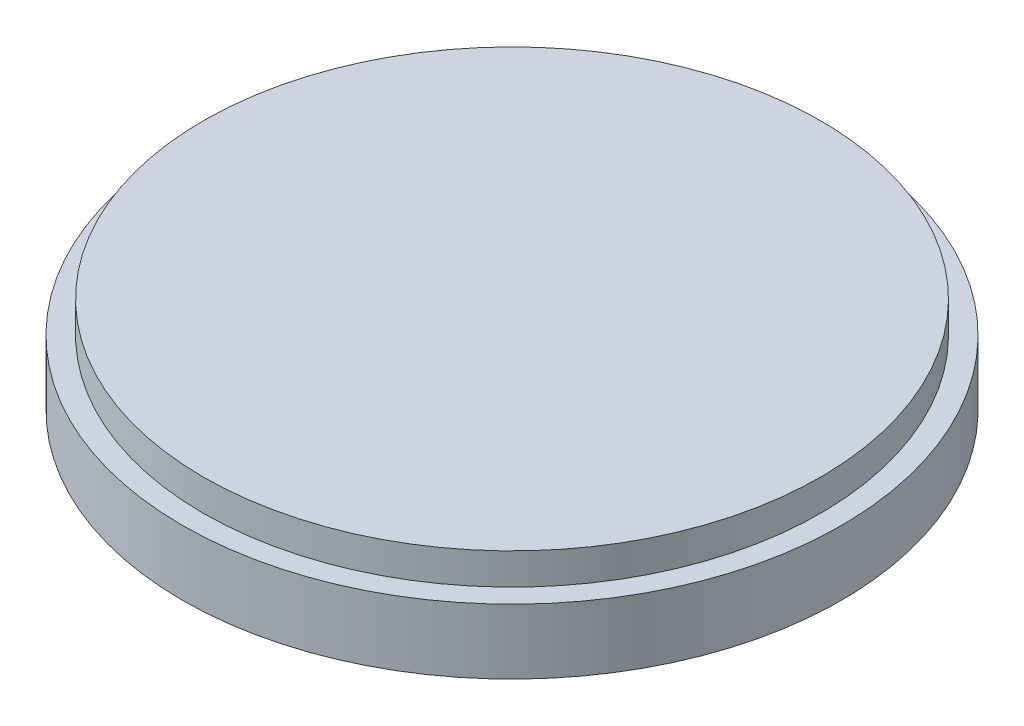
ISO-10303-21;
HEADER;
FILE_DESCRIPTION(('STEP AP214'),'2;1');
FILE_NAME('part.step','',(''),(''),'','','');
FILE_SCHEMA(('AUTOMOTIVE_DESIGN { 1 0 10303 214 1 1 1 1 }'));
ENDSEC;
DATA;
#1=APPLICATION_CONTEXT('core data for automotive mechanical design processes');
#2=APPLICATION_PROTOCOL_DEFINITION('international standard','automotive_design',2000,#1);
#3=PRODUCT_CONTEXT('',#1,'mechanical');
#4=PRODUCT('Part','Part','',(#3));
#5=PRODUCT_RELATED_PRODUCT_CATEGORY('part','',(#4));
#6=PRODUCT_DEFINITION_FORMATION('','',#4);
#7=PRODUCT_DEFINITION_CONTEXT('part definition',#1,'design');
#8=PRODUCT_DEFINITION('design','',#6,#7);
#9=PRODUCT_DEFINITION_SHAPE('','',#8);
#10=(LENGTH_UNIT() NAMED_UNIT(*) SI_UNIT(.MILLI.,.METRE.));
#11=(NAMED_UNIT(*) PLANE_ANGLE_UNIT() SI_UNIT($,.RADIAN.));
#12=(NAMED_UNIT(*) SI_UNIT($,.STERADIAN.) SOLID_ANGLE_UNIT());
#13=UNCERTAINTY_MEASURE_WITH_UNIT(LENGTH_MEASURE(1.E-05),#10,'distance_accuracy_value','');
#14=(GEOMETRIC_REPRESENTATION_CONTEXT(3) GLOBAL_UNCERTAINTY_ASSIGNED_CONTEXT((#13)) GLOBAL_UNIT_ASSIGNED_CONTEXT((#10,
#11,#12)) REPRESENTATION_CONTEXT('',''));
#15=CARTESIAN_POINT('',(0.,0.,0.));
#16=DIRECTION('',(0.,0.,1.));
#17=DIRECTION('',(1.,0.,0.));
#18=AXIS2_PLACEMENT_3D('',#15,#16,#17);
#19=CARTESIAN_POINT('',(-26.5,-7.6,0.));
#20=DIRECTION('',(0.,1.,0.));
#21=DIRECTION('',(0.,0.,1.));
#22=AXIS2_PLACEMENT_3D('',#19,#20,#21);
#23=PLANE('',#22);
#24=CARTESIAN_POINT('',(-15.5563491861041,-7.6,15.556349186104));
#25=DIRECTION('',(0.,-1.,0.));
#26=DIRECTION('',(0.,0.,-1.));
#27=AXIS2_PLACEMENT_3D('',#24,#25,#26);
#28=CIRCLE('',#27,1.69999999999999);
#29=CARTESIAN_POINT('',(-15.5563491861041,-7.6,13.856349186104));
#30=VERTEX_POINT('',#29);
#31=EDGE_CURVE('E64',#30,#30,#28,.T.);
#32=ORIENTED_EDGE('',*,*,#31,.F.);
#33=EDGE_LOOP('',(#32));
#34=FACE_BOUND('',#33,.T.);
#35=CARTESIAN_POINT('',(-15.556349186104,-7.6,-15.5563491861041));
#36=DIRECTION('',(0.,-1.,0.));
#37=DIRECTION('',(0.,0.,-1.));
#38=AXIS2_PLACEMENT_3D('',#35,#36,#37);
#39=CIRCLE('',#38,1.69999999999999);
#40=CARTESIAN_POINT('',(-15.556349186104,-7.6,-17.2563491861041));
#41=VERTEX_POINT('',#40);
#42=EDGE_CURVE('E63',#41,#41,#39,.T.);
#43=ORIENTED_EDGE('',*,*,#42,.F.);
#44=EDGE_LOOP('',(#43));
#45=FACE_BOUND('',#44,.T.);
#46=CARTESIAN_POINT('',(15.5563491861041,-7.6,-15.556349186104));
#47=DIRECTION('',(0.,-1.,0.));
#48=DIRECTION('',(0.,0.,-1.));
#49=AXIS2_PLACEMENT_3D('',#46,#47,#48);
#50=CIRCLE('',#49,1.69999999999999);
#51=CARTESIAN_POINT('',(15.5563491861041,-7.6,-17.256349186104));
#52=VERTEX_POINT('',#51);
#53=EDGE_CURVE('E75',#52,#52,#50,.T.);
#54=ORIENTED_EDGE('',*,*,#53,.F.);
#55=EDGE_LOOP('',(#54));
#56=FACE_BOUND('',#55,.T.);
#57=CARTESIAN_POINT('',(15.556349186104,-7.6,15.5563491861041));
#58=DIRECTION('',(0.,-1.,0.));
#59=DIRECTION('',(0.,0.,-1.));
#60=AXIS2_PLACEMENT_3D('',#57,#58,#59);
#61=CIRCLE('',#60,1.69999999999999);
#62=CARTESIAN_POINT('',(15.556349186104,-7.6,13.8563491861041));
#63=VERTEX_POINT('',#62);
#64=EDGE_CURVE('E81',#63,#63,#61,.T.);
#65=ORIENTED_EDGE('',*,*,#64,.F.);
#66=EDGE_LOOP('',(#65));
#67=FACE_BOUND('',#66,.T.);
#68=CARTESIAN_POINT('',(0.,-7.6,0.));
#69=DIRECTION('',(0.,-1.,0.));
#70=DIRECTION('',(0.,0.,-1.));
#71=AXIS2_PLACEMENT_3D('',#68,#69,#70);
#72=CIRCLE('',#71,26.5);
#73=CARTESIAN_POINT('',(0.,-7.6,-26.5));
#74=VERTEX_POINT('',#73);
#75=EDGE_CURVE('E87',#74,#74,#72,.T.);
#76=ORIENTED_EDGE('',*,*,#75,.T.);
#77=EDGE_LOOP('',(#76));
#78=FACE_BOUND('',#77,.T.);
#79=ADVANCED_FACE('F32',(#34,#45,#56,#67,#78),#23,.F.);
#80=CARTESIAN_POINT('',(-31.5,0.,0.));
#81=DIRECTION('',(0.,1.,0.));
#82=DIRECTION('',(0.,0.,1.));
#83=AXIS2_PLACEMENT_3D('',#80,#81,#82);
#84=PLANE('',#83);
#85=CARTESIAN_POINT('',(0.,0.,0.));
#86=DIRECTION('',(0.,1.,0.));
#87=DIRECTION('',(0.,0.,1.));
#88=AXIS2_PLACEMENT_3D('',#85,#86,#87);
#89=CIRCLE('',#88,29.5);
#90=CARTESIAN_POINT('',(0.,0.,29.5));
#91=VERTEX_POINT('',#90);
#92=EDGE_CURVE('E11',#91,#91,#89,.T.);
#93=ORIENTED_EDGE('',*,*,#92,.F.);
#94=EDGE_LOOP('',(#93));
#95=FACE_BOUND('',#94,.T.);
#96=CARTESIAN_POINT('',(0.,0.,0.));
#97=DIRECTION('',(0.,-1.,0.));
#98=DIRECTION('',(0.,0.,-1.));
#99=AXIS2_PLACEMENT_3D('',#96,#97,#98);
#100=CIRCLE('',#99,31.5);
#101=CARTESIAN_POINT('',(0.,0.,-31.5));
#102=VERTEX_POINT('',#101);
#103=EDGE_CURVE('E35',#102,#102,#100,.T.);
#104=ORIENTED_EDGE('',*,*,#103,.F.);
#105=EDGE_LOOP('',(#104));
#106=FACE_BOUND('',#105,.T.);
#107=ADVANCED_FACE('F99',(#95,#106),#84,.T.);
#108=CARTESIAN_POINT('',(0.,-13.2,0.));
#109=DIRECTION('',(0.,-1.,0.));
#110=DIRECTION('',(0.,0.,-1.));
#111=AXIS2_PLACEMENT_3D('',#108,#109,#110);
#112=CYLINDRICAL_SURFACE('',#111,31.5);
#113=ORIENTED_EDGE('',*,*,#103,.T.);
#114=EDGE_LOOP('',(#113));
#115=FACE_BOUND('',#114,.T.);
#116=CARTESIAN_POINT('',(0.,-6.2,0.));
#117=DIRECTION('',(0.,-1.,0.));
#118=DIRECTION('',(0.,0.,-1.));
#119=AXIS2_PLACEMENT_3D('',#116,#117,#118);
#120=CIRCLE('',#119,31.5);
#121=CARTESIAN_POINT('',(0.,-6.2,-31.5));
#122=VERTEX_POINT('',#121);
#123=EDGE_CURVE('E89',#122,#122,#120,.T.);
#124=ORIENTED_EDGE('',*,*,#123,.F.);
#125=EDGE_LOOP('',(#124));
#126=FACE_BOUND('',#125,.T.);
#127=ADVANCED_FACE('F96',(#115,#126),#112,.T.);
#128=CARTESIAN_POINT('',(0.,-7.6,0.));
#129=DIRECTION('',(0.,1.,0.));
#130=DIRECTION('',(0.,0.,1.));
#131=AXIS2_PLACEMENT_3D('',#128,#129,#130);
#132=CONICAL_SURFACE('',#131,26.5,1.29778762370819);
#133=ORIENTED_EDGE('',*,*,#123,.T.);
#134=EDGE_LOOP('',(#133));
#135=FACE_BOUND('',#134,.T.);
#136=ORIENTED_EDGE('',*,*,#75,.F.);
#137=EDGE_LOOP('',(#136));
#138=FACE_BOUND('',#137,.T.);
#139=ADVANCED_FACE('F106',(#135,#138),#132,.T.);
#140=CARTESIAN_POINT('',(15.556349186104,-3.6,15.5563491861041));
#141=DIRECTION('',(0.,-1.,0.));
#142=DIRECTION('',(0.,0.,-1.));
#143=AXIS2_PLACEMENT_3D('',#140,#141,#142);
#144=CONICAL_SURFACE('',#143,1.69999999999999,1.02974425867665);
#145=CARTESIAN_POINT('',(15.556349186104,-2.57853694765315,15.5563491861041));
#146=VERTEX_POINT('',#145);
#147=VERTEX_LOOP('',#146);
#148=FACE_BOUND('',#147,.T.);
#149=CARTESIAN_POINT('',(15.556349186104,-3.6,15.5563491861041));
#150=DIRECTION('',(0.,-1.,0.));
#151=DIRECTION('',(0.,0.,-1.));
#152=AXIS2_PLACEMENT_3D('',#149,#150,#151);
#153=CIRCLE('',#152,1.69999999999999);
#154=CARTESIAN_POINT('',(15.556349186104,-3.6,13.8563491861041));
#155=VERTEX_POINT('',#154);
#156=EDGE_CURVE('E84',#155,#155,#153,.T.);
#157=ORIENTED_EDGE('',*,*,#156,.T.);
#158=EDGE_LOOP('',(#157));
#159=FACE_BOUND('',#158,.T.);
#160=ADVANCED_FACE('F113',(#148,#159),#144,.F.);
#161=CARTESIAN_POINT('',(15.556349186104,-7.6,15.5563491861041));
#162=DIRECTION('',(0.,-1.,0.));
#163=DIRECTION('',(0.,0.,-1.));
#164=AXIS2_PLACEMENT_3D('',#161,#162,#163);
#165=CYLINDRICAL_SURFACE('',#164,1.69999999999999);
#166=ORIENTED_EDGE('',*,*,#156,.F.);
#167=EDGE_LOOP('',(#166));
#168=FACE_BOUND('',#167,.T.);
#169=ORIENTED_EDGE('',*,*,#64,.T.);
#170=EDGE_LOOP('',(#169));
#171=FACE_BOUND('',#170,.T.);
#172=ADVANCED_FACE('F116',(#168,#171),#165,.F.);
#173=CARTESIAN_POINT('',(15.5563491861041,-3.6,-15.556349186104));
#174=DIRECTION('',(0.,-1.,0.));
#175=DIRECTION('',(0.,0.,-1.));
#176=AXIS2_PLACEMENT_3D('',#173,#174,#175);
#177=CONICAL_SURFACE('',#176,1.69999999999999,1.02974425867665);
#178=CARTESIAN_POINT('',(15.5563491861041,-2.57853694765315,-15.556349186104));
#179=VERTEX_POINT('',#178);
#180=VERTEX_LOOP('',#179);
#181=FACE_BOUND('',#180,.T.);
#182=CARTESIAN_POINT('',(15.5563491861041,-3.6,-15.556349186104));
#183=DIRECTION('',(0.,-1.,0.));
#184=DIRECTION('',(0.,0.,-1.));
#185=AXIS2_PLACEMENT_3D('',#182,#183,#184);
#186=CIRCLE('',#185,1.69999999999999);
#187=CARTESIAN_POINT('',(15.5563491861041,-3.6,-17.256349186104));
#188=VERTEX_POINT('',#187);
#189=EDGE_CURVE('E78',#188,#188,#186,.T.);
#190=ORIENTED_EDGE('',*,*,#189,.T.);
#191=EDGE_LOOP('',(#190));
#192=FACE_BOUND('',#191,.T.);
#193=ADVANCED_FACE('F119',(#181,#192),#177,.F.);
#194=CARTESIAN_POINT('',(15.5563491861041,-7.6,-15.556349186104));
#195=DIRECTION('',(0.,-1.,0.));
#196=DIRECTION('',(0.,0.,-1.));
#197=AXIS2_PLACEMENT_3D('',#194,#195,#196);
#198=CYLINDRICAL_SURFACE('',#197,1.69999999999999);
#199=ORIENTED_EDGE('',*,*,#189,.F.);
#200=EDGE_LOOP('',(#199));
#201=FACE_BOUND('',#200,.T.);
#202=ORIENTED_EDGE('',*,*,#53,.T.);
#203=EDGE_LOOP('',(#202));
#204=FACE_BOUND('',#203,.T.);
#205=ADVANCED_FACE('F123',(#201,#204),#198,.F.);
#206=CARTESIAN_POINT('',(-15.556349186104,-3.6,-15.5563491861041));
#207=DIRECTION('',(0.,-1.,0.));
#208=DIRECTION('',(0.,0.,-1.));
#209=AXIS2_PLACEMENT_3D('',#206,#207,#208);
#210=CONICAL_SURFACE('',#209,1.69999999999999,1.02974425867665);
#211=CARTESIAN_POINT('',(-15.556349186104,-2.57853694765315,-15.5563491861041));
#212=VERTEX_POINT('',#211);
#213=VERTEX_LOOP('',#212);
#214=FACE_BOUND('',#213,.T.);
#215=CARTESIAN_POINT('',(-15.556349186104,-3.6,-15.5563491861041));
#216=DIRECTION('',(0.,-1.,0.));
#217=DIRECTION('',(0.,0.,-1.));
#218=AXIS2_PLACEMENT_3D('',#215,#216,#217);
#219=CIRCLE('',#218,1.69999999999999);
#220=CARTESIAN_POINT('',(-15.556349186104,-3.6,-17.2563491861041));
#221=VERTEX_POINT('',#220);
#222=EDGE_CURVE('E67',#221,#221,#219,.T.);
#223=ORIENTED_EDGE('',*,*,#222,.T.);
#224=EDGE_LOOP('',(#223));
#225=FACE_BOUND('',#224,.T.);
#226=ADVANCED_FACE('F126',(#214,#225),#210,.F.);
#227=CARTESIAN_POINT('',(-15.556349186104,-7.6,-15.5563491861041));
#228=DIRECTION('',(0.,-1.,0.));
#229=DIRECTION('',(0.,0.,-1.));
#230=AXIS2_PLACEMENT_3D('',#227,#228,#229);
#231=CYLINDRICAL_SURFACE('',#230,1.69999999999999);
#232=ORIENTED_EDGE('',*,*,#222,.F.);
#233=EDGE_LOOP('',(#232));
#234=FACE_BOUND('',#233,.T.);
#235=ORIENTED_EDGE('',*,*,#42,.T.);
#236=EDGE_LOOP('',(#235));
#237=FACE_BOUND('',#236,.T.);
#238=ADVANCED_FACE('F57',(#234,#237),#231,.F.);
#239=CARTESIAN_POINT('',(-15.5563491861041,-3.6,15.556349186104));
#240=DIRECTION('',(0.,-1.,0.));
#241=DIRECTION('',(0.,0.,-1.));
#242=AXIS2_PLACEMENT_3D('',#239,#240,#241);
#243=CONICAL_SURFACE('',#242,1.69999999999999,1.02974425867665);
#244=CARTESIAN_POINT('',(-15.5563491861041,-2.57853694765315,15.556349186104));
#245=VERTEX_POINT('',#244);
#246=VERTEX_LOOP('',#245);
#247=FACE_BOUND('',#246,.T.);
#248=CARTESIAN_POINT('',(-15.5563491861041,-3.6,15.556349186104));
#249=DIRECTION('',(0.,-1.,0.));
#250=DIRECTION('',(0.,0.,-1.));
#251=AXIS2_PLACEMENT_3D('',#248,#249,#250);
#252=CIRCLE('',#251,1.69999999999999);
#253=CARTESIAN_POINT('',(-15.5563491861041,-3.6,13.856349186104));
#254=VERTEX_POINT('',#253);
#255=EDGE_CURVE('E61',#254,#254,#252,.T.);
#256=ORIENTED_EDGE('',*,*,#255,.T.);
#257=EDGE_LOOP('',(#256));
#258=FACE_BOUND('',#257,.T.);
#259=ADVANCED_FACE('F53',(#247,#258),#243,.F.);
#260=CARTESIAN_POINT('',(-15.5563491861041,-7.6,15.556349186104));
#261=DIRECTION('',(0.,-1.,0.));
#262=DIRECTION('',(0.,0.,-1.));
#263=AXIS2_PLACEMENT_3D('',#260,#261,#262);
#264=CYLINDRICAL_SURFACE('',#263,1.69999999999999);
#265=ORIENTED_EDGE('',*,*,#255,.F.);
#266=EDGE_LOOP('',(#265));
#267=FACE_BOUND('',#266,.T.);
#268=ORIENTED_EDGE('',*,*,#31,.T.);
#269=EDGE_LOOP('',(#268));
#270=FACE_BOUND('',#269,.T.);
#271=ADVANCED_FACE('F56',(#267,#270),#264,.F.);
#272=CARTESIAN_POINT('',(0.,3.,0.));
#273=DIRECTION('',(0.,-1.,0.));
#274=DIRECTION('',(0.,0.,-1.));
#275=AXIS2_PLACEMENT_3D('',#272,#273,#274);
#276=CYLINDRICAL_SURFACE('',#275,29.5);
#277=CARTESIAN_POINT('',(0.,3.,0.));
#278=DIRECTION('',(0.,1.,0.));
#279=DIRECTION('',(0.,0.,1.));
#280=AXIS2_PLACEMENT_3D('',#277,#278,#279);
#281=CIRCLE('',#280,29.5);
#282=CARTESIAN_POINT('',(0.,3.,29.5));
#283=VERTEX_POINT('',#282);
#284=EDGE_CURVE('E70',#283,#283,#281,.T.);
#285=ORIENTED_EDGE('',*,*,#284,.F.);
#286=EDGE_LOOP('',(#285));
#287=FACE_BOUND('',#286,.T.);
#288=ORIENTED_EDGE('',*,*,#92,.T.);
#289=EDGE_LOOP('',(#288));
#290=FACE_BOUND('',#289,.T.);
#291=ADVANCED_FACE('F136',(#287,#290),#276,.T.);
#292=CARTESIAN_POINT('',(0.,3.,0.));
#293=DIRECTION('',(0.,1.,0.));
#294=DIRECTION('',(0.,0.,1.));
#295=AXIS2_PLACEMENT_3D('',#292,#293,#294);
#296=PLANE('',#295);
#297=ORIENTED_EDGE('',*,*,#284,.T.);
#298=EDGE_LOOP('',(#297));
#299=FACE_BOUND('',#298,.T.);
#300=ADVANCED_FACE('F139',(#299),#296,.T.);
#301=CLOSED_SHELL('',(#79,#107,#127,#139,#160,#172,#193,#205,#226,#238,#259,#271,#291,#300));
#302=MANIFOLD_SOLID_BREP('B2',#301);
#303=ADVANCED_BREP_SHAPE_REPRESENTATION('',(#18,#302),#14);
#304=SHAPE_DEFINITION_REPRESENTATION(#9,#303);
ENDSEC;
END-ISO-10303-21;
